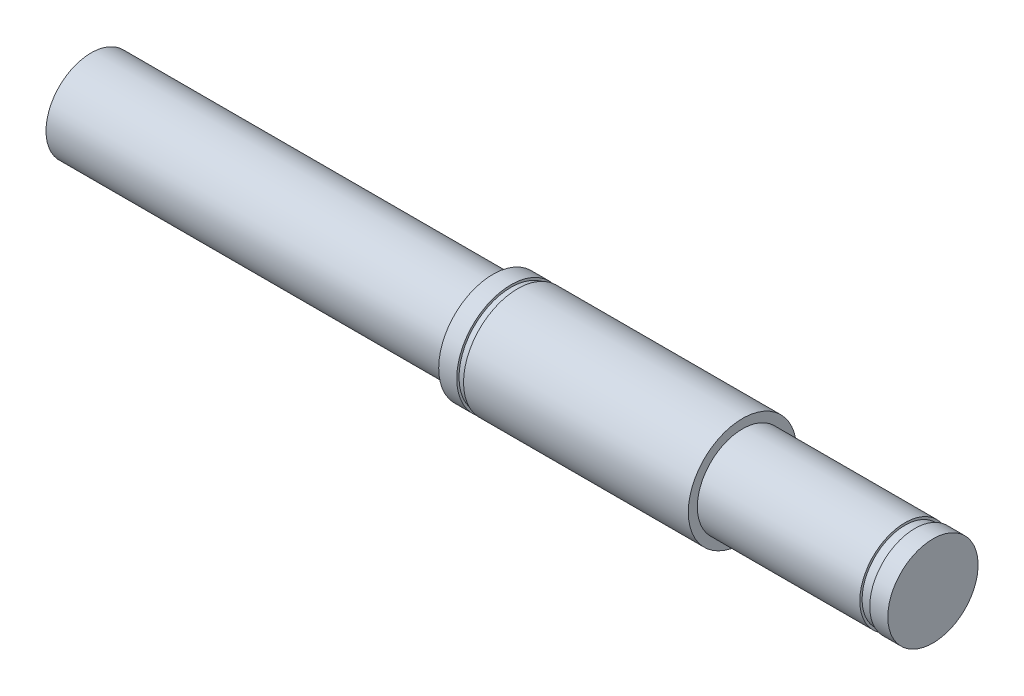
ISO-10303-21;
HEADER;
FILE_DESCRIPTION(('STEP AP214'),'2;1');
FILE_NAME('part.step','',(''),(''),'','','');
FILE_SCHEMA(('AUTOMOTIVE_DESIGN { 1 0 10303 214 1 1 1 1 }'));
ENDSEC;
DATA;
#1=APPLICATION_CONTEXT('core data for automotive mechanical design processes');
#2=APPLICATION_PROTOCOL_DEFINITION('international standard','automotive_design',2000,#1);
#3=PRODUCT_CONTEXT('',#1,'mechanical');
#4=PRODUCT('Part','Part','',(#3));
#5=PRODUCT_RELATED_PRODUCT_CATEGORY('part','',(#4));
#6=PRODUCT_DEFINITION_FORMATION('','',#4);
#7=PRODUCT_DEFINITION_CONTEXT('part definition',#1,'design');
#8=PRODUCT_DEFINITION('design','',#6,#7);
#9=PRODUCT_DEFINITION_SHAPE('','',#8);
#10=(LENGTH_UNIT() NAMED_UNIT(*) SI_UNIT(.MILLI.,.METRE.));
#11=(NAMED_UNIT(*) PLANE_ANGLE_UNIT() SI_UNIT($,.RADIAN.));
#12=(NAMED_UNIT(*) SI_UNIT($,.STERADIAN.) SOLID_ANGLE_UNIT());
#13=UNCERTAINTY_MEASURE_WITH_UNIT(LENGTH_MEASURE(1.E-05),#10,'distance_accuracy_value','');
#14=(GEOMETRIC_REPRESENTATION_CONTEXT(3) GLOBAL_UNCERTAINTY_ASSIGNED_CONTEXT((#13)) GLOBAL_UNIT_ASSIGNED_CONTEXT((#10,
#11,#12)) REPRESENTATION_CONTEXT('',''));
#15=CARTESIAN_POINT('',(0.,0.,0.));
#16=DIRECTION('',(0.,0.,1.));
#17=DIRECTION('',(1.,0.,0.));
#18=AXIS2_PLACEMENT_3D('',#15,#16,#17);
#19=CARTESIAN_POINT('',(-46.5,0.,0.));
#20=DIRECTION('',(1.,0.,0.));
#21=DIRECTION('',(0.,0.,-1.));
#22=AXIS2_PLACEMENT_3D('',#19,#20,#21);
#23=PLANE('',#22);
#24=CARTESIAN_POINT('',(-46.5,0.,0.));
#25=DIRECTION('',(-1.,0.,0.));
#26=DIRECTION('',(0.,0.,1.));
#27=AXIS2_PLACEMENT_3D('',#24,#25,#26);
#28=CIRCLE('',#27,5.);
#29=CARTESIAN_POINT('',(-46.5,0.,5.));
#30=VERTEX_POINT('',#29);
#31=EDGE_CURVE('E10',#30,#30,#28,.T.);
#32=ORIENTED_EDGE('',*,*,#31,.T.);
#33=EDGE_LOOP('',(#32));
#34=FACE_BOUND('',#33,.T.);
#35=ADVANCED_FACE('F41',(#34),#23,.F.);
#36=CARTESIAN_POINT('',(-46.5,0.,0.));
#37=DIRECTION('',(-1.,0.,0.));
#38=DIRECTION('',(0.,0.,1.));
#39=AXIS2_PLACEMENT_3D('',#36,#37,#38);
#40=CYLINDRICAL_SURFACE('',#39,5.);
#41=ORIENTED_EDGE('',*,*,#31,.F.);
#42=EDGE_LOOP('',(#41));
#43=FACE_BOUND('',#42,.T.);
#44=CARTESIAN_POINT('',(-2.,0.,0.));
#45=DIRECTION('',(-1.,0.,0.));
#46=DIRECTION('',(0.,0.,1.));
#47=AXIS2_PLACEMENT_3D('',#44,#45,#46);
#48=CIRCLE('',#47,5.);
#49=CARTESIAN_POINT('',(-2.,0.,5.));
#50=VERTEX_POINT('',#49);
#51=EDGE_CURVE('E48',#50,#50,#48,.T.);
#52=ORIENTED_EDGE('',*,*,#51,.T.);
#53=EDGE_LOOP('',(#52));
#54=FACE_BOUND('',#53,.T.);
#55=ADVANCED_FACE('F117',(#43,#54),#40,.T.);
#56=CARTESIAN_POINT('',(-2.,5.,0.));
#57=DIRECTION('',(1.,0.,0.));
#58=DIRECTION('',(0.,0.,-1.));
#59=AXIS2_PLACEMENT_3D('',#56,#57,#58);
#60=PLANE('',#59);
#61=ORIENTED_EDGE('',*,*,#51,.F.);
#62=EDGE_LOOP('',(#61));
#63=FACE_BOUND('',#62,.T.);
#64=CARTESIAN_POINT('',(-2.,0.,0.));
#65=DIRECTION('',(-1.,0.,0.));
#66=DIRECTION('',(0.,0.,1.));
#67=AXIS2_PLACEMENT_3D('',#64,#65,#66);
#68=CIRCLE('',#67,6.);
#69=CARTESIAN_POINT('',(-2.,0.,6.));
#70=VERTEX_POINT('',#69);
#71=EDGE_CURVE('E53',#70,#70,#68,.T.);
#72=ORIENTED_EDGE('',*,*,#71,.T.);
#73=EDGE_LOOP('',(#72));
#74=FACE_BOUND('',#73,.T.);
#75=ADVANCED_FACE('F121',(#63,#74),#60,.F.);
#76=CARTESIAN_POINT('',(-46.5,0.,0.));
#77=DIRECTION('',(-1.,0.,0.));
#78=DIRECTION('',(0.,0.,1.));
#79=AXIS2_PLACEMENT_3D('',#76,#77,#78);
#80=CYLINDRICAL_SURFACE('',#79,6.);
#81=ORIENTED_EDGE('',*,*,#71,.F.);
#82=EDGE_LOOP('',(#81));
#83=FACE_BOUND('',#82,.T.);
#84=CARTESIAN_POINT('',(0.,0.,0.));
#85=DIRECTION('',(-1.,0.,0.));
#86=DIRECTION('',(0.,0.,1.));
#87=AXIS2_PLACEMENT_3D('',#84,#85,#86);
#88=CIRCLE('',#87,6.);
#89=CARTESIAN_POINT('',(0.,0.,6.));
#90=VERTEX_POINT('',#89);
#91=EDGE_CURVE('E58',#90,#90,#88,.T.);
#92=ORIENTED_EDGE('',*,*,#91,.T.);
#93=EDGE_LOOP('',(#92));
#94=FACE_BOUND('',#93,.T.);
#95=ADVANCED_FACE('F126',(#83,#94),#80,.T.);
#96=CARTESIAN_POINT('',(0.,6.,0.));
#97=DIRECTION('',(-1.,0.,0.));
#98=DIRECTION('',(0.,0.,1.));
#99=AXIS2_PLACEMENT_3D('',#96,#97,#98);
#100=PLANE('',#99);
#101=ORIENTED_EDGE('',*,*,#91,.F.);
#102=EDGE_LOOP('',(#101));
#103=FACE_BOUND('',#102,.T.);
#104=CARTESIAN_POINT('',(0.,0.,0.));
#105=DIRECTION('',(-1.,0.,0.));
#106=DIRECTION('',(0.,0.,1.));
#107=AXIS2_PLACEMENT_3D('',#104,#105,#106);
#108=CIRCLE('',#107,5.75);
#109=CARTESIAN_POINT('',(0.,0.,5.75));
#110=VERTEX_POINT('',#109);
#111=EDGE_CURVE('E64',#110,#110,#108,.T.);
#112=ORIENTED_EDGE('',*,*,#111,.T.);
#113=EDGE_LOOP('',(#112));
#114=FACE_BOUND('',#113,.T.);
#115=ADVANCED_FACE('F132',(#103,#114),#100,.F.);
#116=CARTESIAN_POINT('',(-46.5,0.,0.));
#117=DIRECTION('',(-1.,0.,0.));
#118=DIRECTION('',(0.,0.,1.));
#119=AXIS2_PLACEMENT_3D('',#116,#117,#118);
#120=CYLINDRICAL_SURFACE('',#119,5.75);
#121=ORIENTED_EDGE('',*,*,#111,.F.);
#122=EDGE_LOOP('',(#121));
#123=FACE_BOUND('',#122,.T.);
#124=CARTESIAN_POINT('',(0.750000000000001,0.,0.));
#125=DIRECTION('',(-1.,0.,0.));
#126=DIRECTION('',(0.,0.,1.));
#127=AXIS2_PLACEMENT_3D('',#124,#125,#126);
#128=CIRCLE('',#127,5.75);
#129=CARTESIAN_POINT('',(0.750000000000001,0.,5.75));
#130=VERTEX_POINT('',#129);
#131=EDGE_CURVE('E68',#130,#130,#128,.T.);
#132=ORIENTED_EDGE('',*,*,#131,.T.);
#133=EDGE_LOOP('',(#132));
#134=FACE_BOUND('',#133,.T.);
#135=ADVANCED_FACE('F136',(#123,#134),#120,.T.);
#136=CARTESIAN_POINT('',(0.749999999999998,5.75,0.));
#137=DIRECTION('',(1.,0.,0.));
#138=DIRECTION('',(0.,0.,-1.));
#139=AXIS2_PLACEMENT_3D('',#136,#137,#138);
#140=PLANE('',#139);
#141=ORIENTED_EDGE('',*,*,#131,.F.);
#142=EDGE_LOOP('',(#141));
#143=FACE_BOUND('',#142,.T.);
#144=CARTESIAN_POINT('',(0.750000000000001,0.,0.));
#145=DIRECTION('',(-1.,0.,0.));
#146=DIRECTION('',(0.,0.,1.));
#147=AXIS2_PLACEMENT_3D('',#144,#145,#146);
#148=CIRCLE('',#147,6.);
#149=CARTESIAN_POINT('',(0.750000000000001,0.,6.));
#150=VERTEX_POINT('',#149);
#151=EDGE_CURVE('E72',#150,#150,#148,.T.);
#152=ORIENTED_EDGE('',*,*,#151,.T.);
#153=EDGE_LOOP('',(#152));
#154=FACE_BOUND('',#153,.T.);
#155=ADVANCED_FACE('F140',(#143,#154),#140,.F.);
#156=CARTESIAN_POINT('',(-46.5,0.,0.));
#157=DIRECTION('',(-1.,0.,0.));
#158=DIRECTION('',(0.,0.,1.));
#159=AXIS2_PLACEMENT_3D('',#156,#157,#158);
#160=CYLINDRICAL_SURFACE('',#159,6.);
#161=ORIENTED_EDGE('',*,*,#151,.F.);
#162=EDGE_LOOP('',(#161));
#163=FACE_BOUND('',#162,.T.);
#164=CARTESIAN_POINT('',(25.65,0.,0.));
#165=DIRECTION('',(-1.,0.,0.));
#166=DIRECTION('',(0.,0.,1.));
#167=AXIS2_PLACEMENT_3D('',#164,#165,#166);
#168=CIRCLE('',#167,6.);
#169=CARTESIAN_POINT('',(25.65,0.,6.));
#170=VERTEX_POINT('',#169);
#171=EDGE_CURVE('E76',#170,#170,#168,.T.);
#172=ORIENTED_EDGE('',*,*,#171,.T.);
#173=EDGE_LOOP('',(#172));
#174=FACE_BOUND('',#173,.T.);
#175=ADVANCED_FACE('F144',(#163,#174),#160,.T.);
#176=CARTESIAN_POINT('',(25.65,6.,0.));
#177=DIRECTION('',(-1.,0.,0.));
#178=DIRECTION('',(0.,0.,1.));
#179=AXIS2_PLACEMENT_3D('',#176,#177,#178);
#180=PLANE('',#179);
#181=ORIENTED_EDGE('',*,*,#171,.F.);
#182=EDGE_LOOP('',(#181));
#183=FACE_BOUND('',#182,.T.);
#184=CARTESIAN_POINT('',(25.65,0.,0.));
#185=DIRECTION('',(-1.,0.,0.));
#186=DIRECTION('',(0.,0.,1.));
#187=AXIS2_PLACEMENT_3D('',#184,#185,#186);
#188=CIRCLE('',#187,5.);
#189=CARTESIAN_POINT('',(25.65,0.,5.));
#190=VERTEX_POINT('',#189);
#191=EDGE_CURVE('E80',#190,#190,#188,.T.);
#192=ORIENTED_EDGE('',*,*,#191,.T.);
#193=EDGE_LOOP('',(#192));
#194=FACE_BOUND('',#193,.T.);
#195=ADVANCED_FACE('F148',(#183,#194),#180,.F.);
#196=CARTESIAN_POINT('',(-46.5,0.,0.));
#197=DIRECTION('',(-1.,0.,0.));
#198=DIRECTION('',(0.,0.,1.));
#199=AXIS2_PLACEMENT_3D('',#196,#197,#198);
#200=CYLINDRICAL_SURFACE('',#199,5.);
#201=ORIENTED_EDGE('',*,*,#191,.F.);
#202=EDGE_LOOP('',(#201));
#203=FACE_BOUND('',#202,.T.);
#204=CARTESIAN_POINT('',(43.65,0.,0.));
#205=DIRECTION('',(-1.,0.,0.));
#206=DIRECTION('',(0.,0.,1.));
#207=AXIS2_PLACEMENT_3D('',#204,#205,#206);
#208=CIRCLE('',#207,5.);
#209=CARTESIAN_POINT('',(43.65,0.,5.));
#210=VERTEX_POINT('',#209);
#211=EDGE_CURVE('E84',#210,#210,#208,.T.);
#212=ORIENTED_EDGE('',*,*,#211,.T.);
#213=EDGE_LOOP('',(#212));
#214=FACE_BOUND('',#213,.T.);
#215=ADVANCED_FACE('F152',(#203,#214),#200,.T.);
#216=CARTESIAN_POINT('',(43.65,5.,0.));
#217=DIRECTION('',(-1.,0.,0.));
#218=DIRECTION('',(0.,0.,1.));
#219=AXIS2_PLACEMENT_3D('',#216,#217,#218);
#220=PLANE('',#219);
#221=ORIENTED_EDGE('',*,*,#211,.F.);
#222=EDGE_LOOP('',(#221));
#223=FACE_BOUND('',#222,.T.);
#224=CARTESIAN_POINT('',(43.65,0.,0.));
#225=DIRECTION('',(-1.,0.,0.));
#226=DIRECTION('',(0.,0.,1.));
#227=AXIS2_PLACEMENT_3D('',#224,#225,#226);
#228=CIRCLE('',#227,4.75);
#229=CARTESIAN_POINT('',(43.65,0.,4.75));
#230=VERTEX_POINT('',#229);
#231=EDGE_CURVE('E88',#230,#230,#228,.T.);
#232=ORIENTED_EDGE('',*,*,#231,.T.);
#233=EDGE_LOOP('',(#232));
#234=FACE_BOUND('',#233,.T.);
#235=ADVANCED_FACE('F156',(#223,#234),#220,.F.);
#236=CARTESIAN_POINT('',(-46.5,0.,0.));
#237=DIRECTION('',(-1.,0.,0.));
#238=DIRECTION('',(0.,0.,1.));
#239=AXIS2_PLACEMENT_3D('',#236,#237,#238);
#240=CYLINDRICAL_SURFACE('',#239,4.75);
#241=ORIENTED_EDGE('',*,*,#231,.F.);
#242=EDGE_LOOP('',(#241));
#243=FACE_BOUND('',#242,.T.);
#244=CARTESIAN_POINT('',(44.75,0.,0.));
#245=DIRECTION('',(-1.,0.,0.));
#246=DIRECTION('',(0.,0.,1.));
#247=AXIS2_PLACEMENT_3D('',#244,#245,#246);
#248=CIRCLE('',#247,4.75);
#249=CARTESIAN_POINT('',(44.75,0.,4.75));
#250=VERTEX_POINT('',#249);
#251=EDGE_CURVE('E92',#250,#250,#248,.T.);
#252=ORIENTED_EDGE('',*,*,#251,.T.);
#253=EDGE_LOOP('',(#252));
#254=FACE_BOUND('',#253,.T.);
#255=ADVANCED_FACE('F160',(#243,#254),#240,.T.);
#256=CARTESIAN_POINT('',(44.75,4.75,0.));
#257=DIRECTION('',(1.,0.,0.));
#258=DIRECTION('',(0.,0.,-1.));
#259=AXIS2_PLACEMENT_3D('',#256,#257,#258);
#260=PLANE('',#259);
#261=ORIENTED_EDGE('',*,*,#251,.F.);
#262=EDGE_LOOP('',(#261));
#263=FACE_BOUND('',#262,.T.);
#264=CARTESIAN_POINT('',(44.75,0.,0.));
#265=DIRECTION('',(-1.,0.,0.));
#266=DIRECTION('',(0.,0.,1.));
#267=AXIS2_PLACEMENT_3D('',#264,#265,#266);
#268=CIRCLE('',#267,5.);
#269=CARTESIAN_POINT('',(44.75,0.,5.));
#270=VERTEX_POINT('',#269);
#271=EDGE_CURVE('E96',#270,#270,#268,.T.);
#272=ORIENTED_EDGE('',*,*,#271,.T.);
#273=EDGE_LOOP('',(#272));
#274=FACE_BOUND('',#273,.T.);
#275=ADVANCED_FACE('F113',(#263,#274),#260,.F.);
#276=CARTESIAN_POINT('',(-46.5,0.,0.));
#277=DIRECTION('',(-1.,0.,0.));
#278=DIRECTION('',(0.,0.,1.));
#279=AXIS2_PLACEMENT_3D('',#276,#277,#278);
#280=CYLINDRICAL_SURFACE('',#279,5.);
#281=ORIENTED_EDGE('',*,*,#271,.F.);
#282=EDGE_LOOP('',(#281));
#283=FACE_BOUND('',#282,.T.);
#284=CARTESIAN_POINT('',(46.75,0.,0.));
#285=DIRECTION('',(-1.,0.,0.));
#286=DIRECTION('',(0.,0.,1.));
#287=AXIS2_PLACEMENT_3D('',#284,#285,#286);
#288=CIRCLE('',#287,5.);
#289=CARTESIAN_POINT('',(46.75,0.,5.));
#290=VERTEX_POINT('',#289);
#291=EDGE_CURVE('E100',#290,#290,#288,.T.);
#292=ORIENTED_EDGE('',*,*,#291,.T.);
#293=EDGE_LOOP('',(#292));
#294=FACE_BOUND('',#293,.T.);
#295=ADVANCED_FACE('F105',(#283,#294),#280,.T.);
#296=CARTESIAN_POINT('',(46.75,5.,0.));
#297=DIRECTION('',(-1.,0.,0.));
#298=DIRECTION('',(0.,0.,1.));
#299=AXIS2_PLACEMENT_3D('',#296,#297,#298);
#300=PLANE('',#299);
#301=ORIENTED_EDGE('',*,*,#291,.F.);
#302=EDGE_LOOP('',(#301));
#303=FACE_BOUND('',#302,.T.);
#304=ADVANCED_FACE('F107',(#303),#300,.F.);
#305=CLOSED_SHELL('',(#35,#55,#75,#95,#115,#135,#155,#175,#195,#215,#235,#255,#275,#295,#304));
#306=MANIFOLD_SOLID_BREP('B2',#305);
#307=ADVANCED_BREP_SHAPE_REPRESENTATION('',(#18,#306),#14);
#308=SHAPE_DEFINITION_REPRESENTATION(#9,#307);
ENDSEC;
END-ISO-10303-21;
